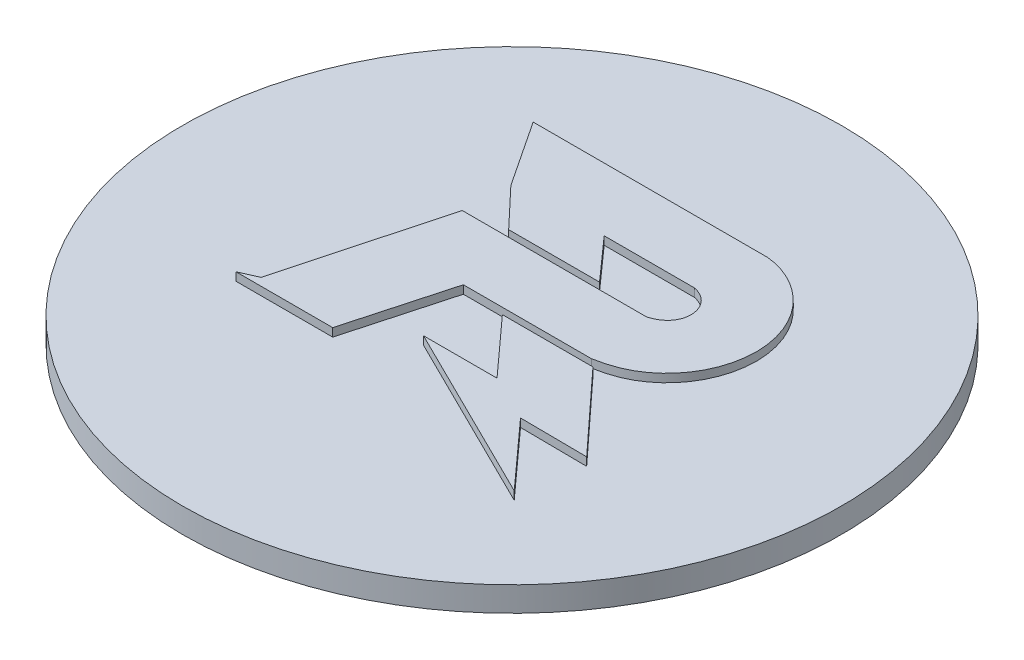
ISO-10303-21;
HEADER;
FILE_DESCRIPTION(('STEP AP214'),'2;1');
FILE_NAME('part.step','',(''),(''),'','','');
FILE_SCHEMA(('AUTOMOTIVE_DESIGN { 1 0 10303 214 1 1 1 1 }'));
ENDSEC;
DATA;
#1=APPLICATION_CONTEXT('core data for automotive mechanical design processes');
#2=APPLICATION_PROTOCOL_DEFINITION('international standard','automotive_design',2000,#1);
#3=PRODUCT_CONTEXT('',#1,'mechanical');
#4=PRODUCT('Part','Part','',(#3));
#5=PRODUCT_RELATED_PRODUCT_CATEGORY('part','',(#4));
#6=PRODUCT_DEFINITION_FORMATION('','',#4);
#7=PRODUCT_DEFINITION_CONTEXT('part definition',#1,'design');
#8=PRODUCT_DEFINITION('design','',#6,#7);
#9=PRODUCT_DEFINITION_SHAPE('','',#8);
#10=(LENGTH_UNIT() NAMED_UNIT(*) SI_UNIT(.MILLI.,.METRE.));
#11=(NAMED_UNIT(*) PLANE_ANGLE_UNIT() SI_UNIT($,.RADIAN.));
#12=(NAMED_UNIT(*) SI_UNIT($,.STERADIAN.) SOLID_ANGLE_UNIT());
#13=UNCERTAINTY_MEASURE_WITH_UNIT(LENGTH_MEASURE(1.E-05),#10,'distance_accuracy_value','');
#14=(GEOMETRIC_REPRESENTATION_CONTEXT(3) GLOBAL_UNCERTAINTY_ASSIGNED_CONTEXT((#13)) GLOBAL_UNIT_ASSIGNED_CONTEXT((#10,
#11,#12)) REPRESENTATION_CONTEXT('',''));
#15=CARTESIAN_POINT('',(0.,0.,0.));
#16=DIRECTION('',(0.,0.,1.));
#17=DIRECTION('',(1.,0.,0.));
#18=AXIS2_PLACEMENT_3D('',#15,#16,#17);
#19=CARTESIAN_POINT('',(19.5142512987434,0.,-24.7797612696507));
#20=DIRECTION('',(0.,1.,0.));
#21=DIRECTION('',(0.,0.,1.));
#22=AXIS2_PLACEMENT_3D('',#19,#20,#21);
#23=PLANE('',#22);
#24=DIRECTION('',(0.265195475393663,0.,-0.964194669053262));
#25=VECTOR('',#24,1.);
#26=CARTESIAN_POINT('',(10.8846042086073,0.,-11.6505341700991));
#27=LINE('',#26,#25);
#28=CARTESIAN_POINT('',(10.8846042086073,0.,-11.6505341700991));
#29=VERTEX_POINT('',#28);
#30=CARTESIAN_POINT('',(14.3049353872212,0.,-24.0861350562784));
#31=VERTEX_POINT('',#30);
#32=EDGE_CURVE('E64',#29,#31,#27,.T.);
#33=ORIENTED_EDGE('',*,*,#32,.F.);
#34=DIRECTION('',(1.,0.,0.));
#35=VECTOR('',#34,1.);
#36=CARTESIAN_POINT('',(-0.848561440974257,0.,-11.6505341700991));
#37=LINE('',#36,#35);
#38=CARTESIAN_POINT('',(-0.848561440974257,0.,-11.6505341700991));
#39=VERTEX_POINT('',#38);
#40=EDGE_CURVE('E229',#39,#29,#37,.T.);
#41=ORIENTED_EDGE('',*,*,#40,.F.);
#42=DIRECTION('',(-0.91330310291896,0.,0.407280544831937));
#43=VECTOR('',#42,1.);
#44=CARTESIAN_POINT('',(1.26278311630415,0.,-12.5920721533469));
#45=LINE('',#44,#43);
#46=CARTESIAN_POINT('',(1.26278311630415,0.,-12.5920721533469));
#47=VERTEX_POINT('',#46);
#48=EDGE_CURVE('E316',#47,#39,#45,.T.);
#49=ORIENTED_EDGE('',*,*,#48,.F.);
#50=DIRECTION('',(-0.259388490118237,0.,0.965773064023936));
#51=VECTOR('',#50,1.);
#52=CARTESIAN_POINT('',(6.42710466994108,0.,-31.8202293016742));
#53=LINE('',#52,#51);
#54=CARTESIAN_POINT('',(6.42710466994108,0.,-31.8202293016742));
#55=VERTEX_POINT('',#54);
#56=EDGE_CURVE('E319',#55,#47,#53,.T.);
#57=ORIENTED_EDGE('',*,*,#56,.F.);
#58=DIRECTION('',(-1.,0.,0.));
#59=VECTOR('',#58,1.);
#60=CARTESIAN_POINT('',(28.8108852548357,0.,-31.8202293016742));
#61=LINE('',#60,#59);
#62=CARTESIAN_POINT('',(28.8108852548357,0.,-31.8202293016742));
#63=VERTEX_POINT('',#62);
#64=EDGE_CURVE('E322',#63,#55,#61,.T.);
#65=ORIENTED_EDGE('',*,*,#64,.F.);
#66=CARTESIAN_POINT('',(28.6565566727028,0.,-37.7775774898836));
#67=CARTESIAN_POINT('',(30.1409444850537,0.,-37.467864791632));
#68=CARTESIAN_POINT('',(32.0172876486831,0.,-36.4476031964085));
#69=CARTESIAN_POINT('',(32.2401033993641,0.,-33.0115497780122));
#70=CARTESIAN_POINT('',(30.0263950399348,0.,-32.2252740160527));
#71=CARTESIAN_POINT('',(28.8108852548357,0.,-31.8202293016742));
#72=B_SPLINE_CURVE_WITH_KNOTS('',5,(#66,#67,#68,#69,#70,#71),.UNSPECIFIED.,.F.,.F.,(6,6),(0.,
1.),.UNSPECIFIED.);
#73=CARTESIAN_POINT('',(28.6565566727028,0.,-37.7775774898836));
#74=VERTEX_POINT('',#73);
#75=EDGE_CURVE('E325',#74,#63,#72,.T.);
#76=ORIENTED_EDGE('',*,*,#75,.F.);
#77=DIRECTION('',(1.,0.,0.));
#78=VECTOR('',#77,1.);
#79=CARTESIAN_POINT('',(17.7069524025357,0.,-37.7775774898836));
#80=LINE('',#79,#78);
#81=CARTESIAN_POINT('',(17.7069524025357,0.,-37.7775774898836));
#82=VERTEX_POINT('',#81);
#83=EDGE_CURVE('E330',#82,#74,#80,.T.);
#84=ORIENTED_EDGE('',*,*,#83,.F.);
#85=DIRECTION('',(-0.664624584207161,0.,-0.747177463570375));
#86=VECTOR('',#85,1.);
#87=CARTESIAN_POINT('',(22.2891068176633,0.,-32.6262746417246));
#88=LINE('',#87,#86);
#89=CARTESIAN_POINT('',(22.2891068176633,0.,-32.6262746417246));
#90=VERTEX_POINT('',#89);
#91=EDGE_CURVE('E336',#90,#82,#88,.T.);
#92=ORIENTED_EDGE('',*,*,#91,.F.);
#93=DIRECTION('',(1.,0.,0.));
#94=VECTOR('',#93,1.);
#95=CARTESIAN_POINT('',(11.2633767102434,0.,-32.6262746417246));
#96=LINE('',#95,#94);
#97=CARTESIAN_POINT('',(11.2633767102434,0.,-32.6262746417246));
#98=VERTEX_POINT('',#97);
#99=EDGE_CURVE('E339',#98,#90,#96,.T.);
#100=ORIENTED_EDGE('',*,*,#99,.F.);
#101=DIRECTION('',(0.686588151118816,0.,0.727046567107806));
#102=VECTOR('',#101,1.);
#103=CARTESIAN_POINT('',(6.75040331158446,0.,-37.4051829459199));
#104=LINE('',#103,#102);
#105=CARTESIAN_POINT('',(6.75040331158446,0.,-37.4051829459199));
#106=VERTEX_POINT('',#105);
#107=EDGE_CURVE('E342',#106,#98,#104,.T.);
#108=ORIENTED_EDGE('',*,*,#107,.F.);
#109=DIRECTION('',(0.55218103496738,0.,0.833724237756318));
#110=VECTOR('',#109,1.);
#111=CARTESIAN_POINT('',(1.44065087914876,0.,-45.4222444150244));
#112=LINE('',#111,#110);
#113=CARTESIAN_POINT('',(1.44065087914876,0.,-45.4222444150244));
#114=VERTEX_POINT('',#113);
#115=EDGE_CURVE('E345',#114,#106,#112,.T.);
#116=ORIENTED_EDGE('',*,*,#115,.F.);
#117=DIRECTION('',(-1.,0.,0.));
#118=VECTOR('',#117,1.);
#119=CARTESIAN_POINT('',(29.9031751989083,0.,-45.4222444150244));
#120=LINE('',#119,#118);
#121=CARTESIAN_POINT('',(29.9031751989083,0.,-45.4222444150244));
#122=VERTEX_POINT('',#121);
#123=EDGE_CURVE('E348',#122,#114,#120,.T.);
#124=ORIENTED_EDGE('',*,*,#123,.F.);
#125=CARTESIAN_POINT('',(29.8299883471756,0.,-24.0861350562784));
#126=CARTESIAN_POINT('',(31.9364843026628,0.,-24.4825638003002));
#127=CARTESIAN_POINT('',(34.3186724707533,0.,-25.1631889911832));
#128=CARTESIAN_POINT('',(36.8993101539624,0.,-26.2918978662841));
#129=CARTESIAN_POINT('',(41.5125169476909,0.,-30.7023474632476));
#130=CARTESIAN_POINT('',(41.4881021329497,0.,-36.1275001148736));
#131=CARTESIAN_POINT('',(39.1486574840498,0.,-41.9300596771056));
#132=CARTESIAN_POINT('',(35.4352859226335,0.,-42.7477106636081));
#133=CARTESIAN_POINT('',(34.0283052842147,0.,-45.0402035919409));
#134=CARTESIAN_POINT('',(29.9031751989083,0.,-45.4222444150244));
#135=B_SPLINE_CURVE_WITH_KNOTS('',9,(#125,#126,#127,#128,#129,#130,#131,#132,#133,#134),
.UNSPECIFIED.,.F.,.F.,(10,10),(0.,1.),.UNSPECIFIED.);
#136=CARTESIAN_POINT('',(29.8299883471756,0.,-24.0861350562784));
#137=VERTEX_POINT('',#136);
#138=EDGE_CURVE('E351',#137,#122,#135,.T.);
#139=ORIENTED_EDGE('',*,*,#138,.F.);
#140=DIRECTION('',(1.,0.,0.));
#141=VECTOR('',#140,1.);
#142=CARTESIAN_POINT('',(14.3049353872212,0.,-24.0861350562784));
#143=LINE('',#142,#141);
#144=EDGE_CURVE('E207',#31,#137,#143,.T.);
#145=ORIENTED_EDGE('',*,*,#144,.F.);
#146=EDGE_LOOP('',(#33,#41,#49,#57,#65,#76,#84,#92,#100,#108,#116,#124,#139,#145));
#147=FACE_BOUND('',#146,.T.);
#148=CARTESIAN_POINT('',(19.5142512987434,0.,-24.7797612696507));
#149=DIRECTION('',(0.,1.,0.));
#150=DIRECTION('',(0.,0.,1.));
#151=AXIS2_PLACEMENT_3D('',#148,#149,#150);
#152=CIRCLE('',#151,40.);
#153=CARTESIAN_POINT('',(19.5142512987434,0.,15.2202387303493));
#154=VERTEX_POINT('',#153);
#155=EDGE_CURVE('E45',#154,#154,#152,.T.);
#156=ORIENTED_EDGE('',*,*,#155,.T.);
#157=EDGE_LOOP('',(#156));
#158=FACE_BOUND('',#157,.T.);
#159=DIRECTION('',(0.672134986823408,0.,0.740428632271806));
#160=VECTOR('',#159,1.);
#161=CARTESIAN_POINT('',(19.8144923217348,0.,-23.3095356992195));
#162=LINE('',#161,#160);
#163=CARTESIAN_POINT('',(19.8144923217348,0.,-23.3095356992195));
#164=VERTEX_POINT('',#163);
#165=CARTESIAN_POINT('',(26.1722847870728,0.,-16.3057467704116));
#166=VERTEX_POINT('',#165);
#167=EDGE_CURVE('E205',#164,#166,#162,.T.);
#168=ORIENTED_EDGE('',*,*,#167,.F.);
#169=DIRECTION('',(-1.,0.,0.));
#170=VECTOR('',#169,1.);
#171=CARTESIAN_POINT('',(30.8093846714069,0.,-23.3095356992195));
#172=LINE('',#171,#170);
#173=CARTESIAN_POINT('',(30.8093846714069,0.,-23.3095356992195));
#174=VERTEX_POINT('',#173);
#175=EDGE_CURVE('E199',#174,#164,#172,.T.);
#176=ORIENTED_EDGE('',*,*,#175,.F.);
#177=DIRECTION('',(-0.678013316343822,0.,-0.735049619318623));
#178=VECTOR('',#177,1.);
#179=CARTESIAN_POINT('',(39.8770640384611,0.,-13.4790587658187));
#180=LINE('',#179,#178);
#181=CARTESIAN_POINT('',(39.8770640384611,0.,-13.4790587658187));
#182=VERTEX_POINT('',#181);
#183=EDGE_CURVE('E184',#182,#174,#180,.T.);
#184=ORIENTED_EDGE('',*,*,#183,.F.);
#185=DIRECTION('',(0.999959050346039,0.,0.00904973099311886));
#186=VECTOR('',#185,1.);
#187=CARTESIAN_POINT('',(31.775865334655,0.,-13.5523754371023));
#188=LINE('',#187,#186);
#189=CARTESIAN_POINT('',(31.775865334655,0.,-13.5523754371023));
#190=VERTEX_POINT('',#189);
#191=EDGE_CURVE('E192',#190,#182,#188,.T.);
#192=ORIENTED_EDGE('',*,*,#191,.F.);
#193=DIRECTION('',(-0.670991979484819,0.,-0.74146460702251));
#194=VECTOR('',#193,1.);
#195=CARTESIAN_POINT('',(39.0495344360977,0.,-5.51477086535487));
#196=LINE('',#195,#194);
#197=CARTESIAN_POINT('',(39.0495344360977,0.,-5.51477086535487));
#198=VERTEX_POINT('',#197);
#199=EDGE_CURVE('E656',#198,#190,#196,.T.);
#200=ORIENTED_EDGE('',*,*,#199,.F.);
#201=DIRECTION('',(0.896240578365711,0.,0.443568287516924));
#202=VECTOR('',#201,1.);
#203=CARTESIAN_POINT('',(38.4221692268369,0.,-5.82526708504956));
#204=LINE('',#203,#202);
#205=CARTESIAN_POINT('',(17.24610358125,0.,-16.3057467704116));
#206=VERTEX_POINT('',#205);
#207=EDGE_CURVE('E658',#206,#198,#204,.T.);
#208=ORIENTED_EDGE('',*,*,#207,.F.);
#209=DIRECTION('',(-1.,0.,0.));
#210=VECTOR('',#209,1.);
#211=CARTESIAN_POINT('',(26.1722847870728,0.,-16.3057467704116));
#212=LINE('',#211,#210);
#213=EDGE_CURVE('E209',#166,#206,#212,.T.);
#214=ORIENTED_EDGE('',*,*,#213,.F.);
#215=EDGE_LOOP('',(#168,#176,#184,#192,#200,#208,#214));
#216=FACE_BOUND('',#215,.T.);
#217=ADVANCED_FACE('F41',(#147,#158,#216),#23,.T.);
#218=CARTESIAN_POINT('',(19.5142512987434,-3.,-24.7797612696507));
#219=DIRECTION('',(0.,1.,0.));
#220=DIRECTION('',(0.,0.,1.));
#221=AXIS2_PLACEMENT_3D('',#218,#219,#220);
#222=CYLINDRICAL_SURFACE('',#221,40.);
#223=CARTESIAN_POINT('',(19.5142512987434,-3.,-24.7797612696507));
#224=DIRECTION('',(0.,1.,0.));
#225=DIRECTION('',(0.,0.,1.));
#226=AXIS2_PLACEMENT_3D('',#223,#224,#225);
#227=CIRCLE('',#226,40.);
#228=CARTESIAN_POINT('',(19.5142512987434,-3.,15.2202387303493));
#229=VERTEX_POINT('',#228);
#230=EDGE_CURVE('E11',#229,#229,#227,.T.);
#231=ORIENTED_EDGE('',*,*,#230,.T.);
#232=EDGE_LOOP('',(#231));
#233=FACE_BOUND('',#232,.T.);
#234=ORIENTED_EDGE('',*,*,#155,.F.);
#235=EDGE_LOOP('',(#234));
#236=FACE_BOUND('',#235,.T.);
#237=ADVANCED_FACE('F43',(#233,#236),#222,.T.);
#238=CARTESIAN_POINT('',(19.5142512987434,-3.,-24.7797612696507));
#239=DIRECTION('',(0.,1.,0.));
#240=DIRECTION('',(0.,0.,1.));
#241=AXIS2_PLACEMENT_3D('',#238,#239,#240);
#242=PLANE('',#241);
#243=ORIENTED_EDGE('',*,*,#230,.F.);
#244=EDGE_LOOP('',(#243));
#245=FACE_BOUND('',#244,.T.);
#246=ADVANCED_FACE('F256',(#245),#242,.F.);
#247=CARTESIAN_POINT('',(10.8846042086073,1.,-11.6505341700991));
#248=DIRECTION('',(-0.964194669053262,0.,-0.265195475393663));
#249=DIRECTION('',(-0.265195475393663,0.,0.964194669053262));
#250=AXIS2_PLACEMENT_3D('',#247,#248,#249);
#251=PLANE('',#250);
#252=ORIENTED_EDGE('',*,*,#32,.T.);
#253=DIRECTION('',(0.,-1.,0.));
#254=VECTOR('',#253,1.);
#255=CARTESIAN_POINT('',(14.3049353872212,1.,-24.0861350562784));
#256=LINE('',#255,#254);
#257=CARTESIAN_POINT('',(14.3049353872212,1.,-24.0861350562784));
#258=VERTEX_POINT('',#257);
#259=EDGE_CURVE('E269',#258,#31,#256,.T.);
#260=ORIENTED_EDGE('',*,*,#259,.F.);
#261=DIRECTION('',(0.265195475393663,0.,-0.964194669053262));
#262=VECTOR('',#261,1.);
#263=CARTESIAN_POINT('',(10.8846042086073,1.,-11.6505341700991));
#264=LINE('',#263,#262);
#265=CARTESIAN_POINT('',(10.8846042086073,1.,-11.6505341700991));
#266=VERTEX_POINT('',#265);
#267=EDGE_CURVE('E225',#266,#258,#264,.T.);
#268=ORIENTED_EDGE('',*,*,#267,.F.);
#269=DIRECTION('',(0.,-1.,0.));
#270=VECTOR('',#269,1.);
#271=CARTESIAN_POINT('',(10.8846042086073,1.,-11.6505341700991));
#272=LINE('',#271,#270);
#273=EDGE_CURVE('E311',#266,#29,#272,.T.);
#274=ORIENTED_EDGE('',*,*,#273,.T.);
#275=EDGE_LOOP('',(#252,#260,#268,#274));
#276=FACE_BOUND('',#275,.T.);
#277=ADVANCED_FACE('F252',(#276),#251,.F.);
#278=CARTESIAN_POINT('',(14.3049353872212,1.,-24.0861350562784));
#279=DIRECTION('',(0.,0.,-1.));
#280=DIRECTION('',(-1.,0.,0.));
#281=AXIS2_PLACEMENT_3D('',#278,#279,#280);
#282=PLANE('',#281);
#283=ORIENTED_EDGE('',*,*,#144,.T.);
#284=DIRECTION('',(0.,-1.,0.));
#285=VECTOR('',#284,1.);
#286=CARTESIAN_POINT('',(29.8299883471756,1.,-24.0861350562784));
#287=LINE('',#286,#285);
#288=CARTESIAN_POINT('',(29.8299883471756,1.,-24.0861350562784));
#289=VERTEX_POINT('',#288);
#290=EDGE_CURVE('E271',#289,#137,#287,.T.);
#291=ORIENTED_EDGE('',*,*,#290,.F.);
#292=DIRECTION('',(1.,0.,0.));
#293=VECTOR('',#292,1.);
#294=CARTESIAN_POINT('',(14.3049353872212,1.,-24.0861350562784));
#295=LINE('',#294,#293);
#296=EDGE_CURVE('E228',#258,#289,#295,.T.);
#297=ORIENTED_EDGE('',*,*,#296,.F.);
#298=ORIENTED_EDGE('',*,*,#259,.T.);
#299=EDGE_LOOP('',(#283,#291,#297,#298));
#300=FACE_BOUND('',#299,.T.);
#301=ADVANCED_FACE('F247',(#300),#282,.F.);
#302=CARTESIAN_POINT('',(29.8299883471756,1.,-24.0861350562784));
#303=CARTESIAN_POINT('',(31.9364843026628,1.,-24.4825638003002));
#304=CARTESIAN_POINT('',(34.3186724707533,1.,-25.1631889911832));
#305=CARTESIAN_POINT('',(36.8993101539624,1.,-26.2918978662841));
#306=CARTESIAN_POINT('',(41.5125169476909,1.,-30.7023474632476));
#307=CARTESIAN_POINT('',(41.4881021329497,1.,-36.1275001148736));
#308=CARTESIAN_POINT('',(39.1486574840498,1.,-41.9300596771056));
#309=CARTESIAN_POINT('',(35.4352859226335,1.,-42.7477106636081));
#310=CARTESIAN_POINT('',(34.0283052842147,1.,-45.0402035919409));
#311=CARTESIAN_POINT('',(29.9031751989083,1.,-45.4222444150244));
#312=B_SPLINE_CURVE_WITH_KNOTS('',9,(#302,#303,#304,#305,#306,#307,#308,#309,#310,#311),
.UNSPECIFIED.,.F.,.F.,(10,10),(0.,1.),.UNSPECIFIED.);
#313=DIRECTION('',(0.,-1.,0.));
#314=VECTOR('',#313,1.);
#315=SURFACE_OF_LINEAR_EXTRUSION('',#312,#314);
#316=ORIENTED_EDGE('',*,*,#138,.T.);
#317=DIRECTION('',(0.,-1.,0.));
#318=VECTOR('',#317,1.);
#319=CARTESIAN_POINT('',(29.9031751989083,1.,-45.4222444150244));
#320=LINE('',#319,#318);
#321=CARTESIAN_POINT('',(29.9031751989083,1.,-45.4222444150244));
#322=VERTEX_POINT('',#321);
#323=EDGE_CURVE('E276',#322,#122,#320,.T.);
#324=ORIENTED_EDGE('',*,*,#323,.F.);
#325=EDGE_CURVE('E231',#289,#322,#312,.T.);
#326=ORIENTED_EDGE('',*,*,#325,.F.);
#327=ORIENTED_EDGE('',*,*,#290,.T.);
#328=EDGE_LOOP('',(#316,#324,#326,#327));
#329=FACE_BOUND('',#328,.T.);
#330=ADVANCED_FACE('F242',(#329),#315,.F.);
#331=CARTESIAN_POINT('',(29.9031751989083,1.,-45.4222444150244));
#332=DIRECTION('',(0.,0.,1.));
#333=DIRECTION('',(1.,0.,0.));
#334=AXIS2_PLACEMENT_3D('',#331,#332,#333);
#335=PLANE('',#334);
#336=ORIENTED_EDGE('',*,*,#123,.T.);
#337=DIRECTION('',(0.,-1.,0.));
#338=VECTOR('',#337,1.);
#339=CARTESIAN_POINT('',(1.44065087914876,1.,-45.4222444150244));
#340=LINE('',#339,#338);
#341=CARTESIAN_POINT('',(1.44065087914876,1.,-45.4222444150244));
#342=VERTEX_POINT('',#341);
#343=EDGE_CURVE('E281',#342,#114,#340,.T.);
#344=ORIENTED_EDGE('',*,*,#343,.F.);
#345=DIRECTION('',(-1.,0.,0.));
#346=VECTOR('',#345,1.);
#347=CARTESIAN_POINT('',(29.9031751989083,1.,-45.4222444150244));
#348=LINE('',#347,#346);
#349=EDGE_CURVE('E236',#322,#342,#348,.T.);
#350=ORIENTED_EDGE('',*,*,#349,.F.);
#351=ORIENTED_EDGE('',*,*,#323,.T.);
#352=EDGE_LOOP('',(#336,#344,#350,#351));
#353=FACE_BOUND('',#352,.T.);
#354=ADVANCED_FACE('F246',(#353),#335,.F.);
#355=CARTESIAN_POINT('',(1.44065087914876,1.,-45.4222444150244));
#356=DIRECTION('',(0.833724237756318,0.,-0.55218103496738));
#357=DIRECTION('',(-0.55218103496738,0.,-0.833724237756318));
#358=AXIS2_PLACEMENT_3D('',#355,#356,#357);
#359=PLANE('',#358);
#360=ORIENTED_EDGE('',*,*,#115,.T.);
#361=DIRECTION('',(0.,-1.,0.));
#362=VECTOR('',#361,1.);
#363=CARTESIAN_POINT('',(6.75040331158446,1.,-37.4051829459199));
#364=LINE('',#363,#362);
#365=CARTESIAN_POINT('',(6.75040331158446,1.,-37.4051829459199));
#366=VERTEX_POINT('',#365);
#367=EDGE_CURVE('E284',#366,#106,#364,.T.);
#368=ORIENTED_EDGE('',*,*,#367,.F.);
#369=DIRECTION('',(0.55218103496738,0.,0.833724237756318));
#370=VECTOR('',#369,1.);
#371=CARTESIAN_POINT('',(1.44065087914876,1.,-45.4222444150244));
#372=LINE('',#371,#370);
#373=EDGE_CURVE('E416',#342,#366,#372,.T.);
#374=ORIENTED_EDGE('',*,*,#373,.F.);
#375=ORIENTED_EDGE('',*,*,#343,.T.);
#376=EDGE_LOOP('',(#360,#368,#374,#375));
#377=FACE_BOUND('',#376,.T.);
#378=ADVANCED_FACE('F399',(#377),#359,.F.);
#379=CARTESIAN_POINT('',(6.75040331158446,1.,-37.4051829459199));
#380=DIRECTION('',(0.727046567107806,0.,-0.686588151118816));
#381=DIRECTION('',(-0.686588151118816,0.,-0.727046567107806));
#382=AXIS2_PLACEMENT_3D('',#379,#380,#381);
#383=PLANE('',#382);
#384=ORIENTED_EDGE('',*,*,#107,.T.);
#385=DIRECTION('',(0.,-1.,0.));
#386=VECTOR('',#385,1.);
#387=CARTESIAN_POINT('',(11.2633767102434,1.,-32.6262746417246));
#388=LINE('',#387,#386);
#389=CARTESIAN_POINT('',(11.2633767102434,1.,-32.6262746417246));
#390=VERTEX_POINT('',#389);
#391=EDGE_CURVE('E287',#390,#98,#388,.T.);
#392=ORIENTED_EDGE('',*,*,#391,.F.);
#393=DIRECTION('',(0.686588151118816,0.,0.727046567107806));
#394=VECTOR('',#393,1.);
#395=CARTESIAN_POINT('',(6.75040331158446,1.,-37.4051829459199));
#396=LINE('',#395,#394);
#397=EDGE_CURVE('E412',#366,#390,#396,.T.);
#398=ORIENTED_EDGE('',*,*,#397,.F.);
#399=ORIENTED_EDGE('',*,*,#367,.T.);
#400=EDGE_LOOP('',(#384,#392,#398,#399));
#401=FACE_BOUND('',#400,.T.);
#402=ADVANCED_FACE('F396',(#401),#383,.F.);
#403=CARTESIAN_POINT('',(11.2633767102434,1.,-32.6262746417246));
#404=DIRECTION('',(0.,0.,-1.));
#405=DIRECTION('',(-1.,0.,0.));
#406=AXIS2_PLACEMENT_3D('',#403,#404,#405);
#407=PLANE('',#406);
#408=ORIENTED_EDGE('',*,*,#99,.T.);
#409=DIRECTION('',(0.,-1.,0.));
#410=VECTOR('',#409,1.);
#411=CARTESIAN_POINT('',(22.2891068176633,1.,-32.6262746417246));
#412=LINE('',#411,#410);
#413=CARTESIAN_POINT('',(22.2891068176633,1.,-32.6262746417246));
#414=VERTEX_POINT('',#413);
#415=EDGE_CURVE('E290',#414,#90,#412,.T.);
#416=ORIENTED_EDGE('',*,*,#415,.F.);
#417=DIRECTION('',(1.,0.,0.));
#418=VECTOR('',#417,1.);
#419=CARTESIAN_POINT('',(11.2633767102434,1.,-32.6262746417246));
#420=LINE('',#419,#418);
#421=EDGE_CURVE('E415',#390,#414,#420,.T.);
#422=ORIENTED_EDGE('',*,*,#421,.F.);
#423=ORIENTED_EDGE('',*,*,#391,.T.);
#424=EDGE_LOOP('',(#408,#416,#422,#423));
#425=FACE_BOUND('',#424,.T.);
#426=ADVANCED_FACE('F392',(#425),#407,.F.);
#427=CARTESIAN_POINT('',(22.2891068176633,1.,-32.6262746417246));
#428=DIRECTION('',(-0.747177463570375,0.,0.664624584207161));
#429=DIRECTION('',(0.664624584207161,0.,0.747177463570375));
#430=AXIS2_PLACEMENT_3D('',#427,#428,#429);
#431=PLANE('',#430);
#432=ORIENTED_EDGE('',*,*,#91,.T.);
#433=DIRECTION('',(0.,-1.,0.));
#434=VECTOR('',#433,1.);
#435=CARTESIAN_POINT('',(17.7069524025357,1.,-37.7775774898836));
#436=LINE('',#435,#434);
#437=CARTESIAN_POINT('',(17.7069524025357,1.,-37.7775774898836));
#438=VERTEX_POINT('',#437);
#439=EDGE_CURVE('E293',#438,#82,#436,.T.);
#440=ORIENTED_EDGE('',*,*,#439,.F.);
#441=DIRECTION('',(-0.664624584207161,0.,-0.747177463570375));
#442=VECTOR('',#441,1.);
#443=CARTESIAN_POINT('',(22.2891068176633,1.,-32.6262746417246));
#444=LINE('',#443,#442);
#445=EDGE_CURVE('E418',#414,#438,#444,.T.);
#446=ORIENTED_EDGE('',*,*,#445,.F.);
#447=ORIENTED_EDGE('',*,*,#415,.T.);
#448=EDGE_LOOP('',(#432,#440,#446,#447));
#449=FACE_BOUND('',#448,.T.);
#450=ADVANCED_FACE('F388',(#449),#431,.F.);
#451=CARTESIAN_POINT('',(17.7069524025357,1.,-37.7775774898836));
#452=DIRECTION('',(0.,0.,-1.));
#453=DIRECTION('',(-1.,0.,0.));
#454=AXIS2_PLACEMENT_3D('',#451,#452,#453);
#455=PLANE('',#454);
#456=ORIENTED_EDGE('',*,*,#83,.T.);
#457=DIRECTION('',(0.,-1.,0.));
#458=VECTOR('',#457,1.);
#459=CARTESIAN_POINT('',(28.6565566727028,1.,-37.7775774898836));
#460=LINE('',#459,#458);
#461=CARTESIAN_POINT('',(28.6565566727028,1.,-37.7775774898836));
#462=VERTEX_POINT('',#461);
#463=EDGE_CURVE('E296',#462,#74,#460,.T.);
#464=ORIENTED_EDGE('',*,*,#463,.F.);
#465=DIRECTION('',(1.,0.,0.));
#466=VECTOR('',#465,1.);
#467=CARTESIAN_POINT('',(17.7069524025357,1.,-37.7775774898836));
#468=LINE('',#467,#466);
#469=EDGE_CURVE('E372',#438,#462,#468,.T.);
#470=ORIENTED_EDGE('',*,*,#469,.F.);
#471=ORIENTED_EDGE('',*,*,#439,.T.);
#472=EDGE_LOOP('',(#456,#464,#470,#471));
#473=FACE_BOUND('',#472,.T.);
#474=ADVANCED_FACE('F383',(#473),#455,.F.);
#475=CARTESIAN_POINT('',(28.6565566727028,1.,-37.7775774898836));
#476=CARTESIAN_POINT('',(30.1409444850537,1.,-37.467864791632));
#477=CARTESIAN_POINT('',(32.0172876486831,1.,-36.4476031964085));
#478=CARTESIAN_POINT('',(32.2401033993641,1.,-33.0115497780122));
#479=CARTESIAN_POINT('',(30.0263950399348,1.,-32.2252740160527));
#480=CARTESIAN_POINT('',(28.8108852548357,1.,-31.8202293016742));
#481=B_SPLINE_CURVE_WITH_KNOTS('',5,(#475,#476,#477,#478,#479,#480),.UNSPECIFIED.,.F.,.F.,(6,6),
(0.,1.),.UNSPECIFIED.);
#482=DIRECTION('',(0.,-1.,0.));
#483=VECTOR('',#482,1.);
#484=SURFACE_OF_LINEAR_EXTRUSION('',#481,#483);
#485=ORIENTED_EDGE('',*,*,#75,.T.);
#486=DIRECTION('',(0.,-1.,0.));
#487=VECTOR('',#486,1.);
#488=CARTESIAN_POINT('',(28.8108852548357,1.,-31.8202293016742));
#489=LINE('',#488,#487);
#490=CARTESIAN_POINT('',(28.8108852548357,1.,-31.8202293016742));
#491=VERTEX_POINT('',#490);
#492=EDGE_CURVE('E299',#491,#63,#489,.T.);
#493=ORIENTED_EDGE('',*,*,#492,.F.);
#494=EDGE_CURVE('E367',#462,#491,#481,.T.);
#495=ORIENTED_EDGE('',*,*,#494,.F.);
#496=ORIENTED_EDGE('',*,*,#463,.T.);
#497=EDGE_LOOP('',(#485,#493,#495,#496));
#498=FACE_BOUND('',#497,.T.);
#499=ADVANCED_FACE('F378',(#498),#484,.F.);
#500=CARTESIAN_POINT('',(28.8108852548357,1.,-31.8202293016742));
#501=DIRECTION('',(0.,0.,1.));
#502=DIRECTION('',(1.,0.,0.));
#503=AXIS2_PLACEMENT_3D('',#500,#501,#502);
#504=PLANE('',#503);
#505=ORIENTED_EDGE('',*,*,#64,.T.);
#506=DIRECTION('',(0.,-1.,0.));
#507=VECTOR('',#506,1.);
#508=CARTESIAN_POINT('',(6.42710466994108,1.,-31.8202293016742));
#509=LINE('',#508,#507);
#510=CARTESIAN_POINT('',(6.42710466994108,1.,-31.8202293016742));
#511=VERTEX_POINT('',#510);
#512=EDGE_CURVE('E302',#511,#55,#509,.T.);
#513=ORIENTED_EDGE('',*,*,#512,.F.);
#514=DIRECTION('',(-1.,0.,0.));
#515=VECTOR('',#514,1.);
#516=CARTESIAN_POINT('',(28.8108852548357,1.,-31.8202293016742));
#517=LINE('',#516,#515);
#518=EDGE_CURVE('E365',#491,#511,#517,.T.);
#519=ORIENTED_EDGE('',*,*,#518,.F.);
#520=ORIENTED_EDGE('',*,*,#492,.T.);
#521=EDGE_LOOP('',(#505,#513,#519,#520));
#522=FACE_BOUND('',#521,.T.);
#523=ADVANCED_FACE('F382',(#522),#504,.F.);
#524=CARTESIAN_POINT('',(6.42710466994108,1.,-31.8202293016742));
#525=DIRECTION('',(0.965773064023936,0.,0.259388490118237));
#526=DIRECTION('',(0.259388490118237,0.,-0.965773064023936));
#527=AXIS2_PLACEMENT_3D('',#524,#525,#526);
#528=PLANE('',#527);
#529=ORIENTED_EDGE('',*,*,#56,.T.);
#530=DIRECTION('',(0.,-1.,0.));
#531=VECTOR('',#530,1.);
#532=CARTESIAN_POINT('',(1.26278311630415,1.,-12.5920721533469));
#533=LINE('',#532,#531);
#534=CARTESIAN_POINT('',(1.26278311630415,1.,-12.5920721533469));
#535=VERTEX_POINT('',#534);
#536=EDGE_CURVE('E305',#535,#47,#533,.T.);
#537=ORIENTED_EDGE('',*,*,#536,.F.);
#538=DIRECTION('',(-0.259388490118237,0.,0.965773064023936));
#539=VECTOR('',#538,1.);
#540=CARTESIAN_POINT('',(6.42710466994108,1.,-31.8202293016742));
#541=LINE('',#540,#539);
#542=EDGE_CURVE('E363',#511,#535,#541,.T.);
#543=ORIENTED_EDGE('',*,*,#542,.F.);
#544=ORIENTED_EDGE('',*,*,#512,.T.);
#545=EDGE_LOOP('',(#529,#537,#543,#544));
#546=FACE_BOUND('',#545,.T.);
#547=ADVANCED_FACE('F435',(#546),#528,.F.);
#548=CARTESIAN_POINT('',(1.26278311630415,1.,-12.5920721533469));
#549=DIRECTION('',(0.407280544831937,0.,0.91330310291896));
#550=DIRECTION('',(0.91330310291896,0.,-0.407280544831937));
#551=AXIS2_PLACEMENT_3D('',#548,#549,#550);
#552=PLANE('',#551);
#553=ORIENTED_EDGE('',*,*,#48,.T.);
#554=DIRECTION('',(0.,-1.,0.));
#555=VECTOR('',#554,1.);
#556=CARTESIAN_POINT('',(-0.848561440974257,1.,-11.6505341700991));
#557=LINE('',#556,#555);
#558=CARTESIAN_POINT('',(-0.848561440974257,1.,-11.6505341700991));
#559=VERTEX_POINT('',#558);
#560=EDGE_CURVE('E308',#559,#39,#557,.T.);
#561=ORIENTED_EDGE('',*,*,#560,.F.);
#562=DIRECTION('',(-0.91330310291896,0.,0.407280544831937));
#563=VECTOR('',#562,1.);
#564=CARTESIAN_POINT('',(1.26278311630415,1.,-12.5920721533469));
#565=LINE('',#564,#563);
#566=EDGE_CURVE('E361',#535,#559,#565,.T.);
#567=ORIENTED_EDGE('',*,*,#566,.F.);
#568=ORIENTED_EDGE('',*,*,#536,.T.);
#569=EDGE_LOOP('',(#553,#561,#567,#568));
#570=FACE_BOUND('',#569,.T.);
#571=ADVANCED_FACE('F437',(#570),#552,.F.);
#572=CARTESIAN_POINT('',(-0.848561440974257,1.,-11.6505341700991));
#573=DIRECTION('',(0.,0.,-1.));
#574=DIRECTION('',(-1.,0.,0.));
#575=AXIS2_PLACEMENT_3D('',#572,#573,#574);
#576=PLANE('',#575);
#577=ORIENTED_EDGE('',*,*,#40,.T.);
#578=ORIENTED_EDGE('',*,*,#273,.F.);
#579=DIRECTION('',(1.,0.,0.));
#580=VECTOR('',#579,1.);
#581=CARTESIAN_POINT('',(-0.848561440974257,1.,-11.6505341700991));
#582=LINE('',#581,#580);
#583=EDGE_CURVE('E314',#559,#266,#582,.T.);
#584=ORIENTED_EDGE('',*,*,#583,.F.);
#585=ORIENTED_EDGE('',*,*,#560,.T.);
#586=EDGE_LOOP('',(#577,#578,#584,#585));
#587=FACE_BOUND('',#586,.T.);
#588=ADVANCED_FACE('F441',(#587),#576,.F.);
#589=CARTESIAN_POINT('',(39.0833321440305,1.,-33.7718962930898));
#590=DIRECTION('',(0.,-1.,0.));
#591=DIRECTION('',(0.,0.,-1.));
#592=AXIS2_PLACEMENT_3D('',#589,#590,#591);
#593=PLANE('',#592);
#594=ORIENTED_EDGE('',*,*,#267,.T.);
#595=ORIENTED_EDGE('',*,*,#296,.T.);
#596=ORIENTED_EDGE('',*,*,#325,.T.);
#597=ORIENTED_EDGE('',*,*,#349,.T.);
#598=ORIENTED_EDGE('',*,*,#373,.T.);
#599=ORIENTED_EDGE('',*,*,#397,.T.);
#600=ORIENTED_EDGE('',*,*,#421,.T.);
#601=ORIENTED_EDGE('',*,*,#445,.T.);
#602=ORIENTED_EDGE('',*,*,#469,.T.);
#603=ORIENTED_EDGE('',*,*,#494,.T.);
#604=ORIENTED_EDGE('',*,*,#518,.T.);
#605=ORIENTED_EDGE('',*,*,#542,.T.);
#606=ORIENTED_EDGE('',*,*,#566,.T.);
#607=ORIENTED_EDGE('',*,*,#583,.T.);
#608=EDGE_LOOP('',(#594,#595,#596,#597,#598,#599,#600,#601,#602,#603,#604,#605,#606,#607));
#609=FACE_BOUND('',#608,.T.);
#610=ADVANCED_FACE('F424',(#609),#593,.F.);
#611=CARTESIAN_POINT('',(30.8093846714069,1.,-23.3095356992195));
#612=DIRECTION('',(0.,0.,1.));
#613=DIRECTION('',(1.,0.,0.));
#614=AXIS2_PLACEMENT_3D('',#611,#612,#613);
#615=PLANE('',#614);
#616=ORIENTED_EDGE('',*,*,#175,.T.);
#617=DIRECTION('',(0.,-1.,0.));
#618=VECTOR('',#617,1.);
#619=CARTESIAN_POINT('',(19.8144923217348,1.,-23.3095356992195));
#620=LINE('',#619,#618);
#621=CARTESIAN_POINT('',(19.8144923217348,1.,-23.3095356992195));
#622=VERTEX_POINT('',#621);
#623=EDGE_CURVE('E639',#622,#164,#620,.T.);
#624=ORIENTED_EDGE('',*,*,#623,.F.);
#625=DIRECTION('',(-1.,0.,0.));
#626=VECTOR('',#625,1.);
#627=CARTESIAN_POINT('',(30.8093846714069,1.,-23.3095356992195));
#628=LINE('',#627,#626);
#629=CARTESIAN_POINT('',(30.8093846714069,1.,-23.3095356992195));
#630=VERTEX_POINT('',#629);
#631=EDGE_CURVE('E193',#630,#622,#628,.T.);
#632=ORIENTED_EDGE('',*,*,#631,.F.);
#633=DIRECTION('',(0.,-1.,0.));
#634=VECTOR('',#633,1.);
#635=CARTESIAN_POINT('',(30.8093846714069,1.,-23.3095356992195));
#636=LINE('',#635,#634);
#637=EDGE_CURVE('E187',#630,#174,#636,.T.);
#638=ORIENTED_EDGE('',*,*,#637,.T.);
#639=EDGE_LOOP('',(#616,#624,#632,#638));
#640=FACE_BOUND('',#639,.T.);
#641=ADVANCED_FACE('F197',(#640),#615,.F.);
#642=CARTESIAN_POINT('',(19.8144923217348,1.,-23.3095356992195));
#643=DIRECTION('',(0.740428632271806,0.,-0.672134986823408));
#644=DIRECTION('',(-0.672134986823408,0.,-0.740428632271806));
#645=AXIS2_PLACEMENT_3D('',#642,#643,#644);
#646=PLANE('',#645);
#647=ORIENTED_EDGE('',*,*,#167,.T.);
#648=DIRECTION('',(0.,-1.,0.));
#649=VECTOR('',#648,1.);
#650=CARTESIAN_POINT('',(26.1722847870728,1.,-16.3057467704116));
#651=LINE('',#650,#649);
#652=CARTESIAN_POINT('',(26.1722847870728,1.,-16.3057467704116));
#653=VERTEX_POINT('',#652);
#654=EDGE_CURVE('E640',#653,#166,#651,.T.);
#655=ORIENTED_EDGE('',*,*,#654,.F.);
#656=DIRECTION('',(0.672134986823408,0.,0.740428632271806));
#657=VECTOR('',#656,1.);
#658=CARTESIAN_POINT('',(19.8144923217348,1.,-23.3095356992195));
#659=LINE('',#658,#657);
#660=EDGE_CURVE('E222',#622,#653,#659,.T.);
#661=ORIENTED_EDGE('',*,*,#660,.F.);
#662=ORIENTED_EDGE('',*,*,#623,.T.);
#663=EDGE_LOOP('',(#647,#655,#661,#662));
#664=FACE_BOUND('',#663,.T.);
#665=ADVANCED_FACE('F564',(#664),#646,.F.);
#666=CARTESIAN_POINT('',(26.1722847870728,1.,-16.3057467704116));
#667=DIRECTION('',(0.,0.,1.));
#668=DIRECTION('',(1.,0.,0.));
#669=AXIS2_PLACEMENT_3D('',#666,#667,#668);
#670=PLANE('',#669);
#671=ORIENTED_EDGE('',*,*,#213,.T.);
#672=DIRECTION('',(0.,-1.,0.));
#673=VECTOR('',#672,1.);
#674=CARTESIAN_POINT('',(17.24610358125,1.,-16.3057467704116));
#675=LINE('',#674,#673);
#676=CARTESIAN_POINT('',(17.24610358125,1.,-16.3057467704116));
#677=VERTEX_POINT('',#676);
#678=EDGE_CURVE('E643',#677,#206,#675,.T.);
#679=ORIENTED_EDGE('',*,*,#678,.F.);
#680=DIRECTION('',(-1.,0.,0.));
#681=VECTOR('',#680,1.);
#682=CARTESIAN_POINT('',(26.1722847870728,1.,-16.3057467704116));
#683=LINE('',#682,#681);
#684=EDGE_CURVE('E220',#653,#677,#683,.T.);
#685=ORIENTED_EDGE('',*,*,#684,.F.);
#686=ORIENTED_EDGE('',*,*,#654,.T.);
#687=EDGE_LOOP('',(#671,#679,#685,#686));
#688=FACE_BOUND('',#687,.T.);
#689=ADVANCED_FACE('F572',(#688),#670,.F.);
#690=CARTESIAN_POINT('',(38.4221692268369,1.,-5.82526708504956));
#691=DIRECTION('',(0.443568287516924,0.,-0.896240578365711));
#692=DIRECTION('',(-0.896240578365711,0.,-0.443568287516924));
#693=AXIS2_PLACEMENT_3D('',#690,#691,#692);
#694=PLANE('',#693);
#695=ORIENTED_EDGE('',*,*,#207,.T.);
#696=DIRECTION('',(0.,-1.,0.));
#697=VECTOR('',#696,1.);
#698=CARTESIAN_POINT('',(39.0495344360977,1.,-5.51477086535487));
#699=LINE('',#698,#697);
#700=CARTESIAN_POINT('',(39.0495344360977,1.,-5.51477086535487));
#701=VERTEX_POINT('',#700);
#702=EDGE_CURVE('E648',#701,#198,#699,.T.);
#703=ORIENTED_EDGE('',*,*,#702,.F.);
#704=DIRECTION('',(0.89624057836571,0.,0.443568287516924));
#705=VECTOR('',#704,1.);
#706=CARTESIAN_POINT('',(17.24610358125,1.,-16.3057467704116));
#707=LINE('',#706,#705);
#708=EDGE_CURVE('E218',#677,#701,#707,.T.);
#709=ORIENTED_EDGE('',*,*,#708,.F.);
#710=ORIENTED_EDGE('',*,*,#678,.T.);
#711=EDGE_LOOP('',(#695,#703,#709,#710));
#712=FACE_BOUND('',#711,.T.);
#713=ADVANCED_FACE('F581',(#712),#694,.F.);
#714=CARTESIAN_POINT('',(39.0495344360977,1.,-5.51477086535487));
#715=DIRECTION('',(-0.74146460702251,0.,0.670991979484819));
#716=DIRECTION('',(0.670991979484819,0.,0.74146460702251));
#717=AXIS2_PLACEMENT_3D('',#714,#715,#716);
#718=PLANE('',#717);
#719=ORIENTED_EDGE('',*,*,#199,.T.);
#720=DIRECTION('',(0.,-1.,0.));
#721=VECTOR('',#720,1.);
#722=CARTESIAN_POINT('',(31.775865334655,1.,-13.5523754371023));
#723=LINE('',#722,#721);
#724=CARTESIAN_POINT('',(31.775865334655,1.,-13.5523754371023));
#725=VERTEX_POINT('',#724);
#726=EDGE_CURVE('E651',#725,#190,#723,.T.);
#727=ORIENTED_EDGE('',*,*,#726,.F.);
#728=DIRECTION('',(-0.670991979484819,0.,-0.74146460702251));
#729=VECTOR('',#728,1.);
#730=CARTESIAN_POINT('',(39.0495344360977,1.,-5.51477086535487));
#731=LINE('',#730,#729);
#732=EDGE_CURVE('E216',#701,#725,#731,.T.);
#733=ORIENTED_EDGE('',*,*,#732,.F.);
#734=ORIENTED_EDGE('',*,*,#702,.T.);
#735=EDGE_LOOP('',(#719,#727,#733,#734));
#736=FACE_BOUND('',#735,.T.);
#737=ADVANCED_FACE('F590',(#736),#718,.F.);
#738=CARTESIAN_POINT('',(31.775865334655,1.,-13.5523754371023));
#739=DIRECTION('',(0.00904973099311886,0.,-0.999959050346039));
#740=DIRECTION('',(-0.999959050346039,0.,-0.00904973099311886));
#741=AXIS2_PLACEMENT_3D('',#738,#739,#740);
#742=PLANE('',#741);
#743=ORIENTED_EDGE('',*,*,#191,.T.);
#744=DIRECTION('',(0.,-1.,0.));
#745=VECTOR('',#744,1.);
#746=CARTESIAN_POINT('',(39.8770640384611,1.,-13.4790587658187));
#747=LINE('',#746,#745);
#748=CARTESIAN_POINT('',(39.8770640384611,1.,-13.4790587658187));
#749=VERTEX_POINT('',#748);
#750=EDGE_CURVE('E56',#749,#182,#747,.T.);
#751=ORIENTED_EDGE('',*,*,#750,.F.);
#752=DIRECTION('',(0.999959050346039,0.,0.00904973099311886));
#753=VECTOR('',#752,1.);
#754=CARTESIAN_POINT('',(31.775865334655,1.,-13.5523754371023));
#755=LINE('',#754,#753);
#756=EDGE_CURVE('E214',#725,#749,#755,.T.);
#757=ORIENTED_EDGE('',*,*,#756,.F.);
#758=ORIENTED_EDGE('',*,*,#726,.T.);
#759=EDGE_LOOP('',(#743,#751,#757,#758));
#760=FACE_BOUND('',#759,.T.);
#761=ADVANCED_FACE('F600',(#760),#742,.F.);
#762=CARTESIAN_POINT('',(39.8770640384611,1.,-13.4790587658187));
#763=DIRECTION('',(-0.735049619318623,0.,0.678013316343822));
#764=DIRECTION('',(0.678013316343822,0.,0.735049619318623));
#765=AXIS2_PLACEMENT_3D('',#762,#763,#764);
#766=PLANE('',#765);
#767=ORIENTED_EDGE('',*,*,#183,.T.);
#768=ORIENTED_EDGE('',*,*,#637,.F.);
#769=DIRECTION('',(-0.678013316343822,0.,-0.735049619318623));
#770=VECTOR('',#769,1.);
#771=CARTESIAN_POINT('',(39.8770640384611,1.,-13.4790587658187));
#772=LINE('',#771,#770);
#773=EDGE_CURVE('E202',#749,#630,#772,.T.);
#774=ORIENTED_EDGE('',*,*,#773,.F.);
#775=ORIENTED_EDGE('',*,*,#750,.T.);
#776=EDGE_LOOP('',(#767,#768,#774,#775));
#777=FACE_BOUND('',#776,.T.);
#778=ADVANCED_FACE('F186',(#777),#766,.F.);
#779=CARTESIAN_POINT('',(0.,1.,0.));
#780=DIRECTION('',(0.,-1.,0.));
#781=DIRECTION('',(0.,0.,-1.));
#782=AXIS2_PLACEMENT_3D('',#779,#780,#781);
#783=PLANE('',#782);
#784=ORIENTED_EDGE('',*,*,#631,.T.);
#785=ORIENTED_EDGE('',*,*,#660,.T.);
#786=ORIENTED_EDGE('',*,*,#684,.T.);
#787=ORIENTED_EDGE('',*,*,#708,.T.);
#788=ORIENTED_EDGE('',*,*,#732,.T.);
#789=ORIENTED_EDGE('',*,*,#756,.T.);
#790=ORIENTED_EDGE('',*,*,#773,.T.);
#791=EDGE_LOOP('',(#784,#785,#786,#787,#788,#789,#790));
#792=FACE_BOUND('',#791,.T.);
#793=ADVANCED_FACE('F617',(#792),#783,.F.);
#794=CLOSED_SHELL('',(#217,#237,#246,#277,#301,#330,#354,#378,#402,#426,#450,#474,#499,#523,
#547,#571,#588,#610,#641,#665,#689,#713,#737,#761,#778,#793));
#795=MANIFOLD_SOLID_BREP('B2',#794);
#796=ADVANCED_BREP_SHAPE_REPRESENTATION('',(#18,#795),#14);
#797=SHAPE_DEFINITION_REPRESENTATION(#9,#796);
ENDSEC;
END-ISO-10303-21;
